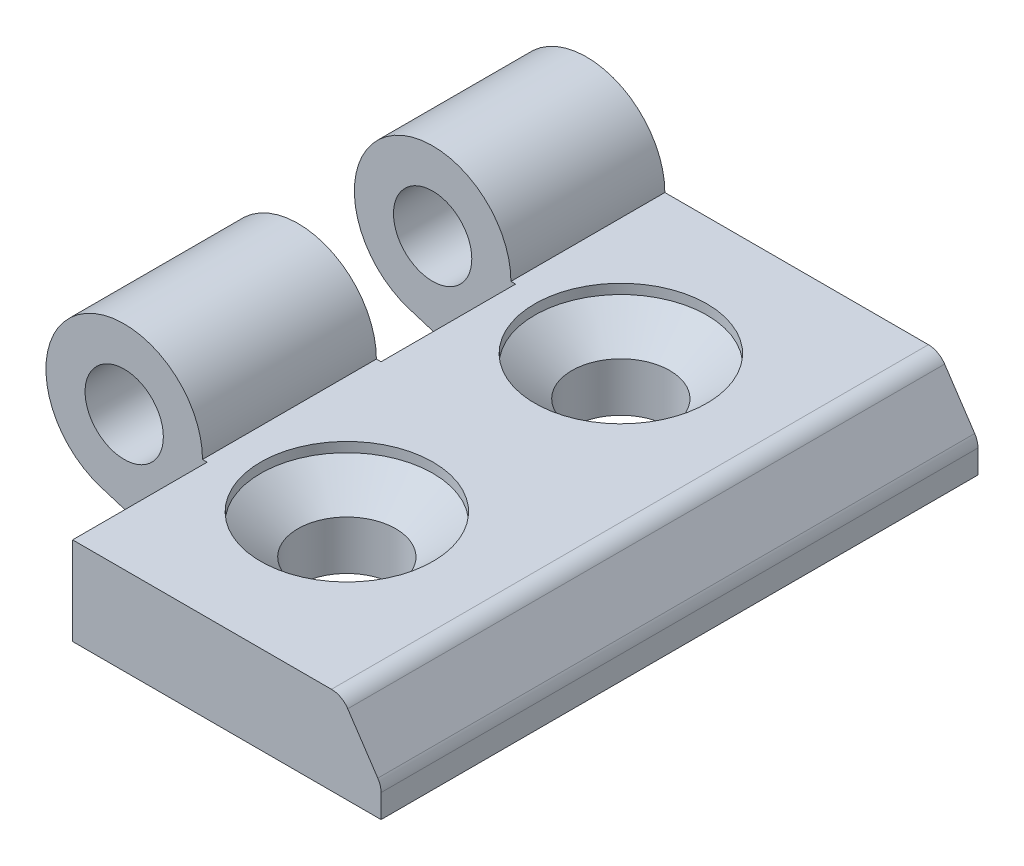
ISO-10303-21;
HEADER;
FILE_DESCRIPTION(('STEP AP214'),'2;1');
FILE_NAME('part.step','',(''),(''),'','','');
FILE_SCHEMA(('AUTOMOTIVE_DESIGN { 1 0 10303 214 1 1 1 1 }'));
ENDSEC;
DATA;
#1=APPLICATION_CONTEXT('core data for automotive mechanical design processes');
#2=APPLICATION_PROTOCOL_DEFINITION('international standard','automotive_design',2000,#1);
#3=PRODUCT_CONTEXT('',#1,'mechanical');
#4=PRODUCT('Part','Part','',(#3));
#5=PRODUCT_RELATED_PRODUCT_CATEGORY('part','',(#4));
#6=PRODUCT_DEFINITION_FORMATION('','',#4);
#7=PRODUCT_DEFINITION_CONTEXT('part definition',#1,'design');
#8=PRODUCT_DEFINITION('design','',#6,#7);
#9=PRODUCT_DEFINITION_SHAPE('','',#8);
#10=(LENGTH_UNIT() NAMED_UNIT(*) SI_UNIT(.MILLI.,.METRE.));
#11=(NAMED_UNIT(*) PLANE_ANGLE_UNIT() SI_UNIT($,.RADIAN.));
#12=(NAMED_UNIT(*) SI_UNIT($,.STERADIAN.) SOLID_ANGLE_UNIT());
#13=UNCERTAINTY_MEASURE_WITH_UNIT(LENGTH_MEASURE(1.E-05),#10,'distance_accuracy_value','');
#14=(GEOMETRIC_REPRESENTATION_CONTEXT(3) GLOBAL_UNCERTAINTY_ASSIGNED_CONTEXT((#13)) GLOBAL_UNIT_ASSIGNED_CONTEXT((#10,
#11,#12)) REPRESENTATION_CONTEXT('',''));
#15=CARTESIAN_POINT('',(0.,0.,0.));
#16=DIRECTION('',(0.,0.,1.));
#17=DIRECTION('',(1.,0.,0.));
#18=AXIS2_PLACEMENT_3D('',#15,#16,#17);
#19=CARTESIAN_POINT('',(0.,0.,15.25));
#20=DIRECTION('',(0.,0.,-1.));
#21=DIRECTION('',(-1.,0.,0.));
#22=AXIS2_PLACEMENT_3D('',#19,#20,#21);
#23=CYLINDRICAL_SURFACE('',#22,4.);
#24=DIRECTION('',(0.,0.,-1.));
#25=VECTOR('',#24,1.);
#26=CARTESIAN_POINT('',(-1.18791441198111,-3.8195365359959,15.25));
#27=LINE('',#26,#25);
#28=CARTESIAN_POINT('',(-1.18791441198111,-3.8195365359959,-7.385));
#29=VERTEX_POINT('',#28);
#30=CARTESIAN_POINT('',(-1.18791441198111,-3.8195365359959,-15.25));
#31=VERTEX_POINT('',#30);
#32=EDGE_CURVE('E257',#29,#31,#27,.T.);
#33=ORIENTED_EDGE('',*,*,#32,.F.);
#34=CARTESIAN_POINT('',(0.,0.,-7.385));
#35=DIRECTION('',(0.,0.,-1.));
#36=DIRECTION('',(-1.,0.,0.));
#37=AXIS2_PLACEMENT_3D('',#34,#35,#36);
#38=CIRCLE('',#37,4.);
#39=CARTESIAN_POINT('',(4.,0.,-7.385));
#40=VERTEX_POINT('',#39);
#41=EDGE_CURVE('E180',#29,#40,#38,.T.);
#42=ORIENTED_EDGE('',*,*,#41,.T.);
#43=DIRECTION('',(0.,0.,-1.));
#44=VECTOR('',#43,1.);
#45=CARTESIAN_POINT('',(4.,0.,15.25));
#46=LINE('',#45,#44);
#47=CARTESIAN_POINT('',(4.,0.,-15.25));
#48=VERTEX_POINT('',#47);
#49=EDGE_CURVE('E261',#40,#48,#46,.T.);
#50=ORIENTED_EDGE('',*,*,#49,.T.);
#51=CARTESIAN_POINT('',(0.,0.,-15.25));
#52=DIRECTION('',(0.,0.,1.));
#53=DIRECTION('',(1.,0.,0.));
#54=AXIS2_PLACEMENT_3D('',#51,#52,#53);
#55=CIRCLE('',#54,4.);
#56=EDGE_CURVE('E225',#48,#31,#55,.T.);
#57=ORIENTED_EDGE('',*,*,#56,.T.);
#58=EDGE_LOOP('',(#33,#42,#50,#57));
#59=FACE_BOUND('',#58,.T.);
#60=ADVANCED_FACE('F37',(#59),#23,.T.);
#61=CARTESIAN_POINT('',(-1.1879144119813,-3.81953653599584,15.25));
#62=DIRECTION('',(-0.296978602995324,-0.954884133998961,0.));
#63=DIRECTION('',(0.954884133998961,-0.296978602995324,0.));
#64=AXIS2_PLACEMENT_3D('',#61,#62,#63);
#65=PLANE('',#64);
#66=DIRECTION('',(0.954884133998961,-0.296978602995324,0.));
#67=VECTOR('',#66,1.);
#68=CARTESIAN_POINT('',(-1.1879144119813,-3.81953653599584,-7.385));
#69=LINE('',#68,#67);
#70=CARTESIAN_POINT('',(1.,-4.5,-7.385));
#71=VERTEX_POINT('',#70);
#72=EDGE_CURVE('E157',#29,#71,#69,.T.);
#73=ORIENTED_EDGE('',*,*,#72,.F.);
#74=ORIENTED_EDGE('',*,*,#32,.T.);
#75=DIRECTION('',(-0.954884133998961,0.296978602995324,0.));
#76=VECTOR('',#75,1.);
#77=CARTESIAN_POINT('',(-1.1879144119813,-3.81953653599584,-15.25));
#78=LINE('',#77,#76);
#79=CARTESIAN_POINT('',(1.,-4.5,-15.25));
#80=VERTEX_POINT('',#79);
#81=EDGE_CURVE('E228',#80,#31,#78,.T.);
#82=ORIENTED_EDGE('',*,*,#81,.F.);
#83=DIRECTION('',(0.,0.,-1.));
#84=VECTOR('',#83,1.);
#85=CARTESIAN_POINT('',(1.,-4.5,15.25));
#86=LINE('',#85,#84);
#87=EDGE_CURVE('E254',#71,#80,#86,.T.);
#88=ORIENTED_EDGE('',*,*,#87,.F.);
#89=EDGE_LOOP('',(#73,#74,#82,#88));
#90=FACE_BOUND('',#89,.T.);
#91=ADVANCED_FACE('F297',(#90),#65,.T.);
#92=CARTESIAN_POINT('',(0.,0.,15.25));
#93=DIRECTION('',(0.,-1.,0.));
#94=DIRECTION('',(0.,0.,-1.));
#95=AXIS2_PLACEMENT_3D('',#92,#93,#94);
#96=PLANE('',#95);
#97=CARTESIAN_POINT('',(10.,0.,-7.));
#98=DIRECTION('',(0.,-1.,0.));
#99=DIRECTION('',(0.,0.,-1.));
#100=AXIS2_PLACEMENT_3D('',#97,#98,#99);
#101=CIRCLE('',#100,4.4);
#102=CARTESIAN_POINT('',(10.,0.,-11.4));
#103=VERTEX_POINT('',#102);
#104=EDGE_CURVE('E505',#103,#103,#101,.T.);
#105=ORIENTED_EDGE('',*,*,#104,.T.);
#106=EDGE_LOOP('',(#105));
#107=FACE_BOUND('',#106,.T.);
#108=CARTESIAN_POINT('',(10.,0.,7.));
#109=DIRECTION('',(0.,-1.,0.));
#110=DIRECTION('',(0.,0.,-1.));
#111=AXIS2_PLACEMENT_3D('',#108,#109,#110);
#112=CIRCLE('',#111,4.4);
#113=CARTESIAN_POINT('',(10.,0.,2.6));
#114=VERTEX_POINT('',#113);
#115=EDGE_CURVE('E518',#114,#114,#112,.T.);
#116=ORIENTED_EDGE('',*,*,#115,.T.);
#117=EDGE_LOOP('',(#116));
#118=FACE_BOUND('',#117,.T.);
#119=ORIENTED_EDGE('',*,*,#49,.F.);
#120=DIRECTION('',(1.,0.,0.));
#121=VECTOR('',#120,1.);
#122=CARTESIAN_POINT('',(0.,0.,-7.385));
#123=LINE('',#122,#121);
#124=CARTESIAN_POINT('',(4.23816539343064,0.,-7.385));
#125=VERTEX_POINT('',#124);
#126=EDGE_CURVE('E183',#40,#125,#123,.T.);
#127=ORIENTED_EDGE('',*,*,#126,.T.);
#128=DIRECTION('',(0.,0.,1.));
#129=VECTOR('',#128,1.);
#130=CARTESIAN_POINT('',(4.23816539343064,0.,15.25));
#131=LINE('',#130,#129);
#132=CARTESIAN_POINT('',(4.23816539343064,0.,-0.51));
#133=VERTEX_POINT('',#132);
#134=EDGE_CURVE('E147',#125,#133,#131,.T.);
#135=ORIENTED_EDGE('',*,*,#134,.T.);
#136=DIRECTION('',(-1.,0.,0.));
#137=VECTOR('',#136,1.);
#138=CARTESIAN_POINT('',(0.,0.,-0.51));
#139=LINE('',#138,#137);
#140=CARTESIAN_POINT('',(4.,0.,-0.51));
#141=VERTEX_POINT('',#140);
#142=EDGE_CURVE('E175',#133,#141,#139,.T.);
#143=ORIENTED_EDGE('',*,*,#142,.T.);
#144=CARTESIAN_POINT('',(4.,0.,8.375));
#145=VERTEX_POINT('',#144);
#146=EDGE_CURVE('E46',#145,#141,#46,.T.);
#147=ORIENTED_EDGE('',*,*,#146,.F.);
#148=DIRECTION('',(1.,0.,0.));
#149=VECTOR('',#148,1.);
#150=CARTESIAN_POINT('',(0.,0.,8.375));
#151=LINE('',#150,#149);
#152=CARTESIAN_POINT('',(4.23816539343069,0.,8.375));
#153=VERTEX_POINT('',#152);
#154=EDGE_CURVE('E202',#145,#153,#151,.T.);
#155=ORIENTED_EDGE('',*,*,#154,.T.);
#156=DIRECTION('',(0.,0.,1.));
#157=VECTOR('',#156,1.);
#158=CARTESIAN_POINT('',(4.23816539343069,0.,15.25));
#159=LINE('',#158,#157);
#160=CARTESIAN_POINT('',(4.23816539343069,0.,15.25));
#161=VERTEX_POINT('',#160);
#162=EDGE_CURVE('E193',#153,#161,#159,.T.);
#163=ORIENTED_EDGE('',*,*,#162,.T.);
#164=DIRECTION('',(-1.,0.,0.));
#165=VECTOR('',#164,1.);
#166=CARTESIAN_POINT('',(0.,0.,15.25));
#167=LINE('',#166,#165);
#168=CARTESIAN_POINT('',(17.4648162415119,0.,15.25));
#169=VERTEX_POINT('',#168);
#170=EDGE_CURVE('E206',#169,#161,#167,.T.);
#171=ORIENTED_EDGE('',*,*,#170,.F.);
#172=DIRECTION('',(0.,0.,-1.));
#173=VECTOR('',#172,1.);
#174=CARTESIAN_POINT('',(17.4648162415119,0.,15.25));
#175=LINE('',#174,#173);
#176=CARTESIAN_POINT('',(17.4648162415119,0.,-15.25));
#177=VERTEX_POINT('',#176);
#178=EDGE_CURVE('E222',#169,#177,#175,.T.);
#179=ORIENTED_EDGE('',*,*,#178,.T.);
#180=DIRECTION('',(-1.,0.,0.));
#181=VECTOR('',#180,1.);
#182=CARTESIAN_POINT('',(0.,0.,-15.25));
#183=LINE('',#182,#181);
#184=EDGE_CURVE('E205',#177,#48,#183,.T.);
#185=ORIENTED_EDGE('',*,*,#184,.T.);
#186=EDGE_LOOP('',(#119,#127,#135,#143,#147,#155,#163,#171,#179,#185));
#187=FACE_BOUND('',#186,.T.);
#188=ADVANCED_FACE('F39',(#107,#118,#187),#96,.F.);
#189=CARTESIAN_POINT('',(0.,0.,-0.51));
#190=DIRECTION('',(0.,0.,1.));
#191=DIRECTION('',(1.,0.,0.));
#192=AXIS2_PLACEMENT_3D('',#189,#190,#191);
#193=CIRCLE('',#192,4.);
#194=CARTESIAN_POINT('',(-1.18791441198111,-3.8195365359959,-0.51));
#195=VERTEX_POINT('',#194);
#196=EDGE_CURVE('E173',#141,#195,#193,.T.);
#197=ORIENTED_EDGE('',*,*,#196,.T.);
#198=CARTESIAN_POINT('',(-1.18791441198111,-3.8195365359959,8.375));
#199=VERTEX_POINT('',#198);
#200=EDGE_CURVE('E258',#199,#195,#27,.T.);
#201=ORIENTED_EDGE('',*,*,#200,.F.);
#202=CARTESIAN_POINT('',(0.,0.,8.375));
#203=DIRECTION('',(0.,0.,-1.));
#204=DIRECTION('',(-1.,0.,0.));
#205=AXIS2_PLACEMENT_3D('',#202,#203,#204);
#206=CIRCLE('',#205,4.);
#207=EDGE_CURVE('E199',#199,#145,#206,.T.);
#208=ORIENTED_EDGE('',*,*,#207,.T.);
#209=ORIENTED_EDGE('',*,*,#146,.T.);
#210=EDGE_LOOP('',(#197,#201,#208,#209));
#211=FACE_BOUND('',#210,.T.);
#212=ADVANCED_FACE('F305',(#211),#23,.T.);
#213=DIRECTION('',(-0.954884133998961,0.296978602995324,0.));
#214=VECTOR('',#213,1.);
#215=CARTESIAN_POINT('',(-1.1879144119813,-3.81953653599584,-0.51));
#216=LINE('',#215,#214);
#217=CARTESIAN_POINT('',(1.,-4.5,-0.51));
#218=VERTEX_POINT('',#217);
#219=EDGE_CURVE('E150',#218,#195,#216,.T.);
#220=ORIENTED_EDGE('',*,*,#219,.F.);
#221=CARTESIAN_POINT('',(1.,-4.5,8.375));
#222=VERTEX_POINT('',#221);
#223=EDGE_CURVE('E255',#222,#218,#86,.T.);
#224=ORIENTED_EDGE('',*,*,#223,.F.);
#225=DIRECTION('',(0.954884133998961,-0.296978602995324,0.));
#226=VECTOR('',#225,1.);
#227=CARTESIAN_POINT('',(-1.1879144119813,-3.81953653599584,8.375));
#228=LINE('',#227,#226);
#229=EDGE_CURVE('E197',#199,#222,#228,.T.);
#230=ORIENTED_EDGE('',*,*,#229,.F.);
#231=ORIENTED_EDGE('',*,*,#200,.T.);
#232=EDGE_LOOP('',(#220,#224,#230,#231));
#233=FACE_BOUND('',#232,.T.);
#234=ADVANCED_FACE('F300',(#233),#65,.T.);
#235=CARTESIAN_POINT('',(0.,-4.5,15.25));
#236=DIRECTION('',(0.,-1.,0.));
#237=DIRECTION('',(0.,0.,-1.));
#238=AXIS2_PLACEMENT_3D('',#235,#236,#237);
#239=PLANE('',#238);
#240=CARTESIAN_POINT('',(10.,-4.5,-7.));
#241=DIRECTION('',(0.,-1.,0.));
#242=DIRECTION('',(0.,0.,-1.));
#243=AXIS2_PLACEMENT_3D('',#240,#241,#242);
#244=CIRCLE('',#243,2.5);
#245=CARTESIAN_POINT('',(10.,-4.5,-9.5));
#246=VERTEX_POINT('',#245);
#247=EDGE_CURVE('E512',#246,#246,#244,.T.);
#248=ORIENTED_EDGE('',*,*,#247,.F.);
#249=EDGE_LOOP('',(#248));
#250=FACE_BOUND('',#249,.T.);
#251=CARTESIAN_POINT('',(10.,-4.5,7.));
#252=DIRECTION('',(0.,-1.,0.));
#253=DIRECTION('',(0.,0.,-1.));
#254=AXIS2_PLACEMENT_3D('',#251,#252,#253);
#255=CIRCLE('',#254,2.5);
#256=CARTESIAN_POINT('',(10.,-4.5,4.5));
#257=VERTEX_POINT('',#256);
#258=EDGE_CURVE('E527',#257,#257,#255,.T.);
#259=ORIENTED_EDGE('',*,*,#258,.F.);
#260=EDGE_LOOP('',(#259));
#261=FACE_BOUND('',#260,.T.);
#262=DIRECTION('',(-1.,0.,0.));
#263=VECTOR('',#262,1.);
#264=CARTESIAN_POINT('',(-4.00000000000006,-4.5,-7.385));
#265=LINE('',#264,#263);
#266=CARTESIAN_POINT('',(4.23816539343064,-4.5,-7.385));
#267=VERTEX_POINT('',#266);
#268=EDGE_CURVE('E154',#267,#71,#265,.T.);
#269=ORIENTED_EDGE('',*,*,#268,.T.);
#270=ORIENTED_EDGE('',*,*,#87,.T.);
#271=DIRECTION('',(-1.,0.,0.));
#272=VECTOR('',#271,1.);
#273=CARTESIAN_POINT('',(0.,-4.5,-15.25));
#274=LINE('',#273,#272);
#275=CARTESIAN_POINT('',(20.,-4.5,-15.25));
#276=VERTEX_POINT('',#275);
#277=EDGE_CURVE('E231',#276,#80,#274,.T.);
#278=ORIENTED_EDGE('',*,*,#277,.F.);
#279=DIRECTION('',(0.,0.,-1.));
#280=VECTOR('',#279,1.);
#281=CARTESIAN_POINT('',(20.,-4.5,15.25));
#282=LINE('',#281,#280);
#283=CARTESIAN_POINT('',(20.,-4.5,15.25));
#284=VERTEX_POINT('',#283);
#285=EDGE_CURVE('E252',#284,#276,#282,.T.);
#286=ORIENTED_EDGE('',*,*,#285,.F.);
#287=DIRECTION('',(-1.,0.,0.));
#288=VECTOR('',#287,1.);
#289=CARTESIAN_POINT('',(0.,-4.5,15.25));
#290=LINE('',#289,#288);
#291=CARTESIAN_POINT('',(4.23816539343069,-4.5,15.25));
#292=VERTEX_POINT('',#291);
#293=EDGE_CURVE('E209',#284,#292,#290,.T.);
#294=ORIENTED_EDGE('',*,*,#293,.T.);
#295=DIRECTION('',(0.,0.,-1.));
#296=VECTOR('',#295,1.);
#297=CARTESIAN_POINT('',(4.23816539343069,-4.5,15.25));
#298=LINE('',#297,#296);
#299=CARTESIAN_POINT('',(4.23816539343069,-4.5,8.375));
#300=VERTEX_POINT('',#299);
#301=EDGE_CURVE('E61',#292,#300,#298,.T.);
#302=ORIENTED_EDGE('',*,*,#301,.T.);
#303=DIRECTION('',(-1.,0.,0.));
#304=VECTOR('',#303,1.);
#305=CARTESIAN_POINT('',(-4.,-4.5,8.375));
#306=LINE('',#305,#304);
#307=EDGE_CURVE('E186',#300,#222,#306,.T.);
#308=ORIENTED_EDGE('',*,*,#307,.T.);
#309=ORIENTED_EDGE('',*,*,#223,.T.);
#310=DIRECTION('',(-1.,0.,0.));
#311=VECTOR('',#310,1.);
#312=CARTESIAN_POINT('',(0.,-4.5,-0.51));
#313=LINE('',#312,#311);
#314=CARTESIAN_POINT('',(4.23816539343064,-4.5,-0.51));
#315=VERTEX_POINT('',#314);
#316=EDGE_CURVE('E11',#315,#218,#313,.T.);
#317=ORIENTED_EDGE('',*,*,#316,.F.);
#318=DIRECTION('',(0.,0.,-1.));
#319=VECTOR('',#318,1.);
#320=CARTESIAN_POINT('',(4.23816539343064,-4.5,-0.51));
#321=LINE('',#320,#319);
#322=EDGE_CURVE('E53',#315,#267,#321,.T.);
#323=ORIENTED_EDGE('',*,*,#322,.T.);
#324=EDGE_LOOP('',(#269,#270,#278,#286,#294,#302,#308,#309,#317,#323));
#325=FACE_BOUND('',#324,.T.);
#326=ADVANCED_FACE('F162',(#250,#261,#325),#239,.T.);
#327=CARTESIAN_POINT('',(20.0000000000009,-3.8252395464981E-12,15.25));
#328=DIRECTION('',(1.,-1.91261977324897E-13,0.));
#329=DIRECTION('',(1.91261977324897E-13,1.,0.));
#330=AXIS2_PLACEMENT_3D('',#327,#328,#329);
#331=PLANE('',#330);
#332=DIRECTION('',(-1.91261977324897E-13,-1.,0.));
#333=VECTOR('',#332,1.);
#334=CARTESIAN_POINT('',(20.0000000000009,-3.8252395464981E-12,-15.25));
#335=LINE('',#334,#333);
#336=CARTESIAN_POINT('',(20.0000000000002,-3.30277563773188,-15.25));
#337=VERTEX_POINT('',#336);
#338=EDGE_CURVE('E234',#337,#276,#335,.T.);
#339=ORIENTED_EDGE('',*,*,#338,.F.);
#340=DIRECTION('',(0.,0.,-1.));
#341=VECTOR('',#340,1.);
#342=CARTESIAN_POINT('',(20.0000000000002,-3.30277563773188,15.25));
#343=LINE('',#342,#341);
#344=CARTESIAN_POINT('',(20.0000000000002,-3.30277563773188,15.25));
#345=VERTEX_POINT('',#344);
#346=EDGE_CURVE('E250',#345,#337,#343,.T.);
#347=ORIENTED_EDGE('',*,*,#346,.F.);
#348=DIRECTION('',(-1.91261977324897E-13,-1.,0.));
#349=VECTOR('',#348,1.);
#350=CARTESIAN_POINT('',(20.0000000000009,-3.8252395464981E-12,15.25));
#351=LINE('',#350,#349);
#352=EDGE_CURVE('E213',#345,#284,#351,.T.);
#353=ORIENTED_EDGE('',*,*,#352,.T.);
#354=ORIENTED_EDGE('',*,*,#285,.T.);
#355=EDGE_LOOP('',(#339,#347,#353,#354));
#356=FACE_BOUND('',#355,.T.);
#357=ADVANCED_FACE('F293',(#356),#331,.T.);
#358=CARTESIAN_POINT('',(19.0000000000002,-3.30277563773188,15.25));
#359=DIRECTION('',(0.,0.,-1.));
#360=DIRECTION('',(-1.,0.,0.));
#361=AXIS2_PLACEMENT_3D('',#358,#359,#360);
#362=CYLINDRICAL_SURFACE('',#361,1.);
#363=CARTESIAN_POINT('',(19.0000000000002,-3.30277563773188,-15.25));
#364=DIRECTION('',(0.,0.,1.));
#365=DIRECTION('',(1.,0.,0.));
#366=AXIS2_PLACEMENT_3D('',#363,#364,#365);
#367=CIRCLE('',#366,1.);
#368=CARTESIAN_POINT('',(19.8320502943381,-2.74807544150671,-15.25));
#369=VERTEX_POINT('',#368);
#370=EDGE_CURVE('E237',#337,#369,#367,.T.);
#371=ORIENTED_EDGE('',*,*,#370,.T.);
#372=DIRECTION('',(0.,0.,-1.));
#373=VECTOR('',#372,1.);
#374=CARTESIAN_POINT('',(19.8320502943381,-2.74807544150671,15.25));
#375=LINE('',#374,#373);
#376=CARTESIAN_POINT('',(19.8320502943381,-2.74807544150671,15.25));
#377=VERTEX_POINT('',#376);
#378=EDGE_CURVE('E247',#377,#369,#375,.T.);
#379=ORIENTED_EDGE('',*,*,#378,.F.);
#380=CARTESIAN_POINT('',(19.0000000000002,-3.30277563773188,15.25));
#381=DIRECTION('',(0.,0.,1.));
#382=DIRECTION('',(1.,0.,0.));
#383=AXIS2_PLACEMENT_3D('',#380,#381,#382);
#384=CIRCLE('',#383,1.);
#385=EDGE_CURVE('E216',#345,#377,#384,.T.);
#386=ORIENTED_EDGE('',*,*,#385,.F.);
#387=ORIENTED_EDGE('',*,*,#346,.T.);
#388=EDGE_LOOP('',(#371,#379,#386,#387));
#389=FACE_BOUND('',#388,.T.);
#390=ADVANCED_FACE('F290',(#389),#362,.T.);
#391=CARTESIAN_POINT('',(12.4615384615365,8.30769230769303,15.25));
#392=DIRECTION('',(-0.83205029433778,-0.554700196225324,0.));
#393=DIRECTION('',(0.554700196225324,-0.83205029433778,0.));
#394=AXIS2_PLACEMENT_3D('',#391,#392,#393);
#395=PLANE('',#394);
#396=DIRECTION('',(-0.554700196225324,0.83205029433778,0.));
#397=VECTOR('',#396,1.);
#398=CARTESIAN_POINT('',(12.4615384615365,8.30769230769303,-15.25));
#399=LINE('',#398,#397);
#400=CARTESIAN_POINT('',(18.2968665358498,-0.445299803774822,-15.25));
#401=VERTEX_POINT('',#400);
#402=EDGE_CURVE('E239',#369,#401,#399,.T.);
#403=ORIENTED_EDGE('',*,*,#402,.T.);
#404=DIRECTION('',(0.,0.,-1.));
#405=VECTOR('',#404,1.);
#406=CARTESIAN_POINT('',(18.2968665358498,-0.445299803774822,15.25));
#407=LINE('',#406,#405);
#408=CARTESIAN_POINT('',(18.2968665358498,-0.445299803774822,15.25));
#409=VERTEX_POINT('',#408);
#410=EDGE_CURVE('E244',#409,#401,#407,.T.);
#411=ORIENTED_EDGE('',*,*,#410,.F.);
#412=DIRECTION('',(-0.554700196225324,0.83205029433778,0.));
#413=VECTOR('',#412,1.);
#414=CARTESIAN_POINT('',(12.4615384615365,8.30769230769303,15.25));
#415=LINE('',#414,#413);
#416=EDGE_CURVE('E218',#377,#409,#415,.T.);
#417=ORIENTED_EDGE('',*,*,#416,.F.);
#418=ORIENTED_EDGE('',*,*,#378,.T.);
#419=EDGE_LOOP('',(#403,#411,#417,#418));
#420=FACE_BOUND('',#419,.T.);
#421=ADVANCED_FACE('F285',(#420),#395,.F.);
#422=CARTESIAN_POINT('',(17.4648162415119,-1.,15.25));
#423=DIRECTION('',(0.,0.,-1.));
#424=DIRECTION('',(-1.,0.,0.));
#425=AXIS2_PLACEMENT_3D('',#422,#423,#424);
#426=CYLINDRICAL_SURFACE('',#425,1.);
#427=CARTESIAN_POINT('',(17.4648162415119,-1.,-15.25));
#428=DIRECTION('',(0.,0.,1.));
#429=DIRECTION('',(1.,0.,0.));
#430=AXIS2_PLACEMENT_3D('',#427,#428,#429);
#431=CIRCLE('',#430,1.);
#432=EDGE_CURVE('E210',#401,#177,#431,.T.);
#433=ORIENTED_EDGE('',*,*,#432,.T.);
#434=ORIENTED_EDGE('',*,*,#178,.F.);
#435=CARTESIAN_POINT('',(17.4648162415119,-1.,15.25));
#436=DIRECTION('',(0.,0.,1.));
#437=DIRECTION('',(1.,0.,0.));
#438=AXIS2_PLACEMENT_3D('',#435,#436,#437);
#439=CIRCLE('',#438,1.);
#440=EDGE_CURVE('E220',#409,#169,#439,.T.);
#441=ORIENTED_EDGE('',*,*,#440,.F.);
#442=ORIENTED_EDGE('',*,*,#410,.T.);
#443=EDGE_LOOP('',(#433,#434,#441,#442));
#444=FACE_BOUND('',#443,.T.);
#445=ADVANCED_FACE('F279',(#444),#426,.T.);
#446=CARTESIAN_POINT('',(0.,0.,15.25));
#447=DIRECTION('',(0.,0.,1.));
#448=DIRECTION('',(1.,0.,0.));
#449=AXIS2_PLACEMENT_3D('',#446,#447,#448);
#450=PLANE('',#449);
#451=DIRECTION('',(0.,1.,0.));
#452=VECTOR('',#451,1.);
#453=CARTESIAN_POINT('',(4.23816539343069,-4.5,15.25));
#454=LINE('',#453,#452);
#455=EDGE_CURVE('E189',#292,#161,#454,.T.);
#456=ORIENTED_EDGE('',*,*,#455,.F.);
#457=ORIENTED_EDGE('',*,*,#293,.F.);
#458=ORIENTED_EDGE('',*,*,#352,.F.);
#459=ORIENTED_EDGE('',*,*,#385,.T.);
#460=ORIENTED_EDGE('',*,*,#416,.T.);
#461=ORIENTED_EDGE('',*,*,#440,.T.);
#462=ORIENTED_EDGE('',*,*,#170,.T.);
#463=EDGE_LOOP('',(#456,#457,#458,#459,#460,#461,#462));
#464=FACE_BOUND('',#463,.T.);
#465=ADVANCED_FACE('F325',(#464),#450,.T.);
#466=CARTESIAN_POINT('',(0.,0.,-15.25));
#467=DIRECTION('',(0.,0.,1.));
#468=DIRECTION('',(1.,0.,0.));
#469=AXIS2_PLACEMENT_3D('',#466,#467,#468);
#470=PLANE('',#469);
#471=CARTESIAN_POINT('',(0.,0.,-15.25));
#472=DIRECTION('',(0.,0.,1.));
#473=DIRECTION('',(1.,0.,0.));
#474=AXIS2_PLACEMENT_3D('',#471,#472,#473);
#475=CIRCLE('',#474,2.);
#476=CARTESIAN_POINT('',(2.,0.,-15.25));
#477=VERTEX_POINT('',#476);
#478=EDGE_CURVE('E531',#477,#477,#475,.T.);
#479=ORIENTED_EDGE('',*,*,#478,.T.);
#480=EDGE_LOOP('',(#479));
#481=FACE_BOUND('',#480,.T.);
#482=ORIENTED_EDGE('',*,*,#184,.F.);
#483=ORIENTED_EDGE('',*,*,#432,.F.);
#484=ORIENTED_EDGE('',*,*,#402,.F.);
#485=ORIENTED_EDGE('',*,*,#370,.F.);
#486=ORIENTED_EDGE('',*,*,#338,.T.);
#487=ORIENTED_EDGE('',*,*,#277,.T.);
#488=ORIENTED_EDGE('',*,*,#81,.T.);
#489=ORIENTED_EDGE('',*,*,#56,.F.);
#490=EDGE_LOOP('',(#482,#483,#484,#485,#486,#487,#488,#489));
#491=FACE_BOUND('',#490,.T.);
#492=ADVANCED_FACE('F272',(#481,#491),#470,.F.);
#493=CARTESIAN_POINT('',(-4.,-4.5,8.375));
#494=DIRECTION('',(0.,0.,-1.));
#495=DIRECTION('',(-1.,0.,0.));
#496=AXIS2_PLACEMENT_3D('',#493,#494,#495);
#497=PLANE('',#496);
#498=CARTESIAN_POINT('',(0.,0.,8.375));
#499=DIRECTION('',(0.,0.,1.));
#500=DIRECTION('',(1.,0.,0.));
#501=AXIS2_PLACEMENT_3D('',#498,#499,#500);
#502=CIRCLE('',#501,2.);
#503=CARTESIAN_POINT('',(2.,0.,8.375));
#504=VERTEX_POINT('',#503);
#505=EDGE_CURVE('E530',#504,#504,#502,.T.);
#506=ORIENTED_EDGE('',*,*,#505,.F.);
#507=EDGE_LOOP('',(#506));
#508=FACE_BOUND('',#507,.T.);
#509=ORIENTED_EDGE('',*,*,#207,.F.);
#510=ORIENTED_EDGE('',*,*,#229,.T.);
#511=ORIENTED_EDGE('',*,*,#307,.F.);
#512=DIRECTION('',(0.,1.,0.));
#513=VECTOR('',#512,1.);
#514=CARTESIAN_POINT('',(4.23816539343069,-4.5,8.375));
#515=LINE('',#514,#513);
#516=EDGE_CURVE('E190',#300,#153,#515,.T.);
#517=ORIENTED_EDGE('',*,*,#516,.T.);
#518=ORIENTED_EDGE('',*,*,#154,.F.);
#519=EDGE_LOOP('',(#509,#510,#511,#517,#518));
#520=FACE_BOUND('',#519,.T.);
#521=ADVANCED_FACE('F322',(#508,#520),#497,.F.);
#522=CARTESIAN_POINT('',(4.23816539343069,-4.5,15.25));
#523=DIRECTION('',(1.,0.,0.));
#524=DIRECTION('',(0.,0.,-1.));
#525=AXIS2_PLACEMENT_3D('',#522,#523,#524);
#526=PLANE('',#525);
#527=ORIENTED_EDGE('',*,*,#516,.F.);
#528=ORIENTED_EDGE('',*,*,#301,.F.);
#529=ORIENTED_EDGE('',*,*,#455,.T.);
#530=ORIENTED_EDGE('',*,*,#162,.F.);
#531=EDGE_LOOP('',(#527,#528,#529,#530));
#532=FACE_BOUND('',#531,.T.);
#533=ADVANCED_FACE('F326',(#532),#526,.F.);
#534=CARTESIAN_POINT('',(-4.00000000000006,-4.5,-7.385));
#535=DIRECTION('',(0.,0.,-1.));
#536=DIRECTION('',(-1.,0.,0.));
#537=AXIS2_PLACEMENT_3D('',#534,#535,#536);
#538=PLANE('',#537);
#539=CARTESIAN_POINT('',(0.,0.,-7.385));
#540=DIRECTION('',(0.,0.,-1.));
#541=DIRECTION('',(-1.,0.,0.));
#542=AXIS2_PLACEMENT_3D('',#539,#540,#541);
#543=CIRCLE('',#542,2.);
#544=CARTESIAN_POINT('',(-2.,0.,-7.385));
#545=VERTEX_POINT('',#544);
#546=EDGE_CURVE('E164',#545,#545,#543,.T.);
#547=ORIENTED_EDGE('',*,*,#546,.T.);
#548=EDGE_LOOP('',(#547));
#549=FACE_BOUND('',#548,.T.);
#550=ORIENTED_EDGE('',*,*,#41,.F.);
#551=ORIENTED_EDGE('',*,*,#72,.T.);
#552=ORIENTED_EDGE('',*,*,#268,.F.);
#553=DIRECTION('',(0.,1.,0.));
#554=VECTOR('',#553,1.);
#555=CARTESIAN_POINT('',(4.23816539343064,-4.5,-7.385));
#556=LINE('',#555,#554);
#557=EDGE_CURVE('E143',#267,#125,#556,.T.);
#558=ORIENTED_EDGE('',*,*,#557,.T.);
#559=ORIENTED_EDGE('',*,*,#126,.F.);
#560=EDGE_LOOP('',(#550,#551,#552,#558,#559));
#561=FACE_BOUND('',#560,.T.);
#562=ADVANCED_FACE('F155',(#549,#561),#538,.F.);
#563=CARTESIAN_POINT('',(4.23816539343064,-4.5,-0.51));
#564=DIRECTION('',(1.,0.,0.));
#565=DIRECTION('',(0.,0.,-1.));
#566=AXIS2_PLACEMENT_3D('',#563,#564,#565);
#567=PLANE('',#566);
#568=ORIENTED_EDGE('',*,*,#557,.F.);
#569=ORIENTED_EDGE('',*,*,#322,.F.);
#570=DIRECTION('',(0.,1.,0.));
#571=VECTOR('',#570,1.);
#572=CARTESIAN_POINT('',(4.23816539343064,-4.5,-0.51));
#573=LINE('',#572,#571);
#574=EDGE_CURVE('E151',#315,#133,#573,.T.);
#575=ORIENTED_EDGE('',*,*,#574,.T.);
#576=ORIENTED_EDGE('',*,*,#134,.F.);
#577=EDGE_LOOP('',(#568,#569,#575,#576));
#578=FACE_BOUND('',#577,.T.);
#579=ADVANCED_FACE('F145',(#578),#567,.F.);
#580=CARTESIAN_POINT('',(-4.00000000000006,-4.5,-0.51));
#581=DIRECTION('',(0.,0.,1.));
#582=DIRECTION('',(1.,0.,0.));
#583=AXIS2_PLACEMENT_3D('',#580,#581,#582);
#584=PLANE('',#583);
#585=CARTESIAN_POINT('',(0.,0.,-0.51));
#586=DIRECTION('',(0.,0.,1.));
#587=DIRECTION('',(1.,0.,0.));
#588=AXIS2_PLACEMENT_3D('',#585,#586,#587);
#589=CIRCLE('',#588,2.);
#590=CARTESIAN_POINT('',(2.,0.,-0.51));
#591=VERTEX_POINT('',#590);
#592=EDGE_CURVE('E41',#591,#591,#589,.T.);
#593=ORIENTED_EDGE('',*,*,#592,.T.);
#594=EDGE_LOOP('',(#593));
#595=FACE_BOUND('',#594,.T.);
#596=ORIENTED_EDGE('',*,*,#574,.F.);
#597=ORIENTED_EDGE('',*,*,#316,.T.);
#598=ORIENTED_EDGE('',*,*,#219,.T.);
#599=ORIENTED_EDGE('',*,*,#196,.F.);
#600=ORIENTED_EDGE('',*,*,#142,.F.);
#601=EDGE_LOOP('',(#596,#597,#598,#599,#600));
#602=FACE_BOUND('',#601,.T.);
#603=ADVANCED_FACE('F323',(#595,#602),#584,.F.);
#604=CARTESIAN_POINT('',(0.,0.,-15.25));
#605=DIRECTION('',(0.,0.,1.));
#606=DIRECTION('',(1.,0.,0.));
#607=AXIS2_PLACEMENT_3D('',#604,#605,#606);
#608=CYLINDRICAL_SURFACE('',#607,2.);
#609=ORIENTED_EDGE('',*,*,#505,.T.);
#610=EDGE_LOOP('',(#609));
#611=FACE_BOUND('',#610,.T.);
#612=ORIENTED_EDGE('',*,*,#592,.F.);
#613=EDGE_LOOP('',(#612));
#614=FACE_BOUND('',#613,.T.);
#615=ADVANCED_FACE('F400',(#611,#614),#608,.F.);
#616=ORIENTED_EDGE('',*,*,#478,.F.);
#617=EDGE_LOOP('',(#616));
#618=FACE_BOUND('',#617,.T.);
#619=ORIENTED_EDGE('',*,*,#546,.F.);
#620=EDGE_LOOP('',(#619));
#621=FACE_BOUND('',#620,.T.);
#622=ADVANCED_FACE('F409',(#618,#621),#608,.F.);
#623=CARTESIAN_POINT('',(10.,-4.5,7.));
#624=DIRECTION('',(0.,-1.,0.));
#625=DIRECTION('',(0.,0.,-1.));
#626=AXIS2_PLACEMENT_3D('',#623,#624,#625);
#627=CYLINDRICAL_SURFACE('',#626,2.5);
#628=CARTESIAN_POINT('',(10.,-2.,7.));
#629=DIRECTION('',(0.,-1.,0.));
#630=DIRECTION('',(0.,0.,-1.));
#631=AXIS2_PLACEMENT_3D('',#628,#629,#630);
#632=CIRCLE('',#631,2.5);
#633=CARTESIAN_POINT('',(10.,-2.,4.5));
#634=VERTEX_POINT('',#633);
#635=EDGE_CURVE('E524',#634,#634,#632,.T.);
#636=ORIENTED_EDGE('',*,*,#635,.F.);
#637=EDGE_LOOP('',(#636));
#638=FACE_BOUND('',#637,.T.);
#639=ORIENTED_EDGE('',*,*,#258,.T.);
#640=EDGE_LOOP('',(#639));
#641=FACE_BOUND('',#640,.T.);
#642=ADVANCED_FACE('F419',(#638,#641),#627,.F.);
#643=CARTESIAN_POINT('',(10.,-2.,7.));
#644=DIRECTION('',(0.,1.,0.));
#645=DIRECTION('',(0.,0.,1.));
#646=AXIS2_PLACEMENT_3D('',#643,#644,#645);
#647=CONICAL_SURFACE('',#646,2.5,0.902506907964312);
#648=CARTESIAN_POINT('',(10.,-0.5,7.));
#649=DIRECTION('',(0.,-1.,0.));
#650=DIRECTION('',(0.,0.,-1.));
#651=AXIS2_PLACEMENT_3D('',#648,#649,#650);
#652=CIRCLE('',#651,4.4);
#653=CARTESIAN_POINT('',(10.,-0.5,2.6));
#654=VERTEX_POINT('',#653);
#655=EDGE_CURVE('E521',#654,#654,#652,.T.);
#656=ORIENTED_EDGE('',*,*,#655,.F.);
#657=EDGE_LOOP('',(#656));
#658=FACE_BOUND('',#657,.T.);
#659=ORIENTED_EDGE('',*,*,#635,.T.);
#660=EDGE_LOOP('',(#659));
#661=FACE_BOUND('',#660,.T.);
#662=ADVANCED_FACE('F428',(#658,#661),#647,.F.);
#663=CARTESIAN_POINT('',(10.,-4.5,7.));
#664=DIRECTION('',(0.,-1.,0.));
#665=DIRECTION('',(0.,0.,-1.));
#666=AXIS2_PLACEMENT_3D('',#663,#664,#665);
#667=CYLINDRICAL_SURFACE('',#666,4.4);
#668=ORIENTED_EDGE('',*,*,#115,.F.);
#669=EDGE_LOOP('',(#668));
#670=FACE_BOUND('',#669,.T.);
#671=ORIENTED_EDGE('',*,*,#655,.T.);
#672=EDGE_LOOP('',(#671));
#673=FACE_BOUND('',#672,.T.);
#674=ADVANCED_FACE('F438',(#670,#673),#667,.F.);
#675=CARTESIAN_POINT('',(10.,-4.5,-7.));
#676=DIRECTION('',(0.,-1.,0.));
#677=DIRECTION('',(0.,0.,-1.));
#678=AXIS2_PLACEMENT_3D('',#675,#676,#677);
#679=CYLINDRICAL_SURFACE('',#678,2.5);
#680=CARTESIAN_POINT('',(10.,-2.,-7.));
#681=DIRECTION('',(0.,-1.,0.));
#682=DIRECTION('',(0.,0.,-1.));
#683=AXIS2_PLACEMENT_3D('',#680,#681,#682);
#684=CIRCLE('',#683,2.5);
#685=CARTESIAN_POINT('',(10.,-2.,-9.5));
#686=VERTEX_POINT('',#685);
#687=EDGE_CURVE('E509',#686,#686,#684,.T.);
#688=ORIENTED_EDGE('',*,*,#687,.F.);
#689=EDGE_LOOP('',(#688));
#690=FACE_BOUND('',#689,.T.);
#691=ORIENTED_EDGE('',*,*,#247,.T.);
#692=EDGE_LOOP('',(#691));
#693=FACE_BOUND('',#692,.T.);
#694=ADVANCED_FACE('F448',(#690,#693),#679,.F.);
#695=CARTESIAN_POINT('',(10.,-2.,-7.));
#696=DIRECTION('',(0.,1.,0.));
#697=DIRECTION('',(0.,0.,1.));
#698=AXIS2_PLACEMENT_3D('',#695,#696,#697);
#699=CONICAL_SURFACE('',#698,2.5,0.902506907964312);
#700=CARTESIAN_POINT('',(10.,-0.5,-7.));
#701=DIRECTION('',(0.,-1.,0.));
#702=DIRECTION('',(0.,0.,-1.));
#703=AXIS2_PLACEMENT_3D('',#700,#701,#702);
#704=CIRCLE('',#703,4.4);
#705=CARTESIAN_POINT('',(10.,-0.5,-11.4));
#706=VERTEX_POINT('',#705);
#707=EDGE_CURVE('E508',#706,#706,#704,.T.);
#708=ORIENTED_EDGE('',*,*,#707,.F.);
#709=EDGE_LOOP('',(#708));
#710=FACE_BOUND('',#709,.T.);
#711=ORIENTED_EDGE('',*,*,#687,.T.);
#712=EDGE_LOOP('',(#711));
#713=FACE_BOUND('',#712,.T.);
#714=ADVANCED_FACE('F470',(#710,#713),#699,.F.);
#715=CARTESIAN_POINT('',(10.,-4.5,-7.));
#716=DIRECTION('',(0.,-1.,0.));
#717=DIRECTION('',(0.,0.,-1.));
#718=AXIS2_PLACEMENT_3D('',#715,#716,#717);
#719=CYLINDRICAL_SURFACE('',#718,4.4);
#720=ORIENTED_EDGE('',*,*,#104,.F.);
#721=EDGE_LOOP('',(#720));
#722=FACE_BOUND('',#721,.T.);
#723=ORIENTED_EDGE('',*,*,#707,.T.);
#724=EDGE_LOOP('',(#723));
#725=FACE_BOUND('',#724,.T.);
#726=ADVANCED_FACE('F480',(#722,#725),#719,.F.);
#727=CLOSED_SHELL('',(#60,#91,#188,#212,#234,#326,#357,#390,#421,#445,#465,#492,#521,#533,#562,
#579,#603,#615,#622,#642,#662,#674,#694,#714,#726));
#728=MANIFOLD_SOLID_BREP('B2',#727);
#729=ADVANCED_BREP_SHAPE_REPRESENTATION('',(#18,#728),#14);
#730=SHAPE_DEFINITION_REPRESENTATION(#9,#729);
ENDSEC;
END-ISO-10303-21;
